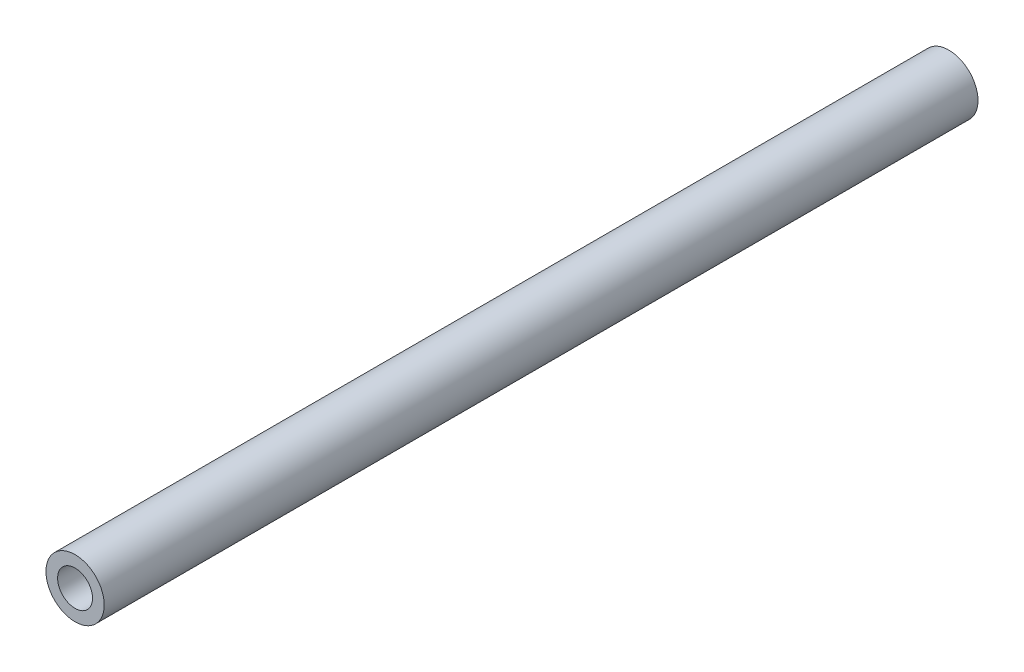
ISO-10303-21;
HEADER;
FILE_DESCRIPTION(('STEP AP214'),'2;1');
FILE_NAME('part.step','',(''),(''),'','','');
FILE_SCHEMA(('AUTOMOTIVE_DESIGN { 1 0 10303 214 1 1 1 1 }'));
ENDSEC;
DATA;
#1=APPLICATION_CONTEXT('core data for automotive mechanical design processes');
#2=APPLICATION_PROTOCOL_DEFINITION('international standard','automotive_design',2000,#1);
#3=PRODUCT_CONTEXT('',#1,'mechanical');
#4=PRODUCT('Part','Part','',(#3));
#5=PRODUCT_RELATED_PRODUCT_CATEGORY('part','',(#4));
#6=PRODUCT_DEFINITION_FORMATION('','',#4);
#7=PRODUCT_DEFINITION_CONTEXT('part definition',#1,'design');
#8=PRODUCT_DEFINITION('design','',#6,#7);
#9=PRODUCT_DEFINITION_SHAPE('','',#8);
#10=(LENGTH_UNIT() NAMED_UNIT(*) SI_UNIT(.MILLI.,.METRE.));
#11=(NAMED_UNIT(*) PLANE_ANGLE_UNIT() SI_UNIT($,.RADIAN.));
#12=(NAMED_UNIT(*) SI_UNIT($,.STERADIAN.) SOLID_ANGLE_UNIT());
#13=UNCERTAINTY_MEASURE_WITH_UNIT(LENGTH_MEASURE(1.E-05),#10,'distance_accuracy_value','');
#14=(GEOMETRIC_REPRESENTATION_CONTEXT(3) GLOBAL_UNCERTAINTY_ASSIGNED_CONTEXT((#13)) GLOBAL_UNIT_ASSIGNED_CONTEXT((#10,
#11,#12)) REPRESENTATION_CONTEXT('',''));
#15=CARTESIAN_POINT('',(0.,0.,0.));
#16=DIRECTION('',(0.,0.,1.));
#17=DIRECTION('',(1.,0.,0.));
#18=AXIS2_PLACEMENT_3D('',#15,#16,#17);
#19=CARTESIAN_POINT('',(0.,0.,37.5));
#20=DIRECTION('',(0.,0.,1.));
#21=DIRECTION('',(1.,0.,0.));
#22=AXIS2_PLACEMENT_3D('',#19,#20,#21);
#23=PLANE('',#22);
#24=CARTESIAN_POINT('',(0.,0.,37.5));
#25=DIRECTION('',(0.,0.,1.));
#26=DIRECTION('',(1.,0.,0.));
#27=AXIS2_PLACEMENT_3D('',#24,#25,#26);
#28=CIRCLE('',#27,2.5);
#29=CARTESIAN_POINT('',(2.5,0.,37.5));
#30=VERTEX_POINT('',#29);
#31=EDGE_CURVE('E10',#30,#30,#28,.T.);
#32=ORIENTED_EDGE('',*,*,#31,.T.);
#33=EDGE_LOOP('',(#32));
#34=FACE_BOUND('',#33,.T.);
#35=CARTESIAN_POINT('',(0.,0.,37.5));
#36=DIRECTION('',(0.,0.,1.));
#37=DIRECTION('',(1.,0.,0.));
#38=AXIS2_PLACEMENT_3D('',#35,#36,#37);
#39=CIRCLE('',#38,1.5);
#40=CARTESIAN_POINT('',(1.5,0.,37.5));
#41=VERTEX_POINT('',#40);
#42=EDGE_CURVE('E42',#41,#41,#39,.T.);
#43=ORIENTED_EDGE('',*,*,#42,.F.);
#44=EDGE_LOOP('',(#43));
#45=FACE_BOUND('',#44,.T.);
#46=ADVANCED_FACE('F31',(#34,#45),#23,.T.);
#47=CARTESIAN_POINT('',(0.,0.,-37.5));
#48=DIRECTION('',(0.,0.,1.));
#49=DIRECTION('',(1.,0.,0.));
#50=AXIS2_PLACEMENT_3D('',#47,#48,#49);
#51=PLANE('',#50);
#52=CARTESIAN_POINT('',(0.,0.,-37.5));
#53=DIRECTION('',(0.,0.,1.));
#54=DIRECTION('',(1.,0.,0.));
#55=AXIS2_PLACEMENT_3D('',#52,#53,#54);
#56=CIRCLE('',#55,2.5);
#57=CARTESIAN_POINT('',(2.5,0.,-37.5));
#58=VERTEX_POINT('',#57);
#59=EDGE_CURVE('E35',#58,#58,#56,.T.);
#60=ORIENTED_EDGE('',*,*,#59,.F.);
#61=EDGE_LOOP('',(#60));
#62=FACE_BOUND('',#61,.T.);
#63=CARTESIAN_POINT('',(0.,0.,-37.5));
#64=DIRECTION('',(0.,0.,1.));
#65=DIRECTION('',(1.,0.,0.));
#66=AXIS2_PLACEMENT_3D('',#63,#64,#65);
#67=CIRCLE('',#66,1.5);
#68=CARTESIAN_POINT('',(1.5,0.,-37.5));
#69=VERTEX_POINT('',#68);
#70=EDGE_CURVE('E44',#69,#69,#67,.T.);
#71=ORIENTED_EDGE('',*,*,#70,.T.);
#72=EDGE_LOOP('',(#71));
#73=FACE_BOUND('',#72,.T.);
#74=ADVANCED_FACE('F54',(#62,#73),#51,.F.);
#75=CARTESIAN_POINT('',(0.,0.,37.5));
#76=DIRECTION('',(0.,0.,-1.));
#77=DIRECTION('',(-1.,0.,0.));
#78=AXIS2_PLACEMENT_3D('',#75,#76,#77);
#79=CYLINDRICAL_SURFACE('',#78,2.5);
#80=ORIENTED_EDGE('',*,*,#31,.F.);
#81=EDGE_LOOP('',(#80));
#82=FACE_BOUND('',#81,.T.);
#83=ORIENTED_EDGE('',*,*,#59,.T.);
#84=EDGE_LOOP('',(#83));
#85=FACE_BOUND('',#84,.T.);
#86=ADVANCED_FACE('F33',(#82,#85),#79,.T.);
#87=CARTESIAN_POINT('',(0.,0.,37.5));
#88=DIRECTION('',(0.,0.,-1.));
#89=DIRECTION('',(-1.,0.,0.));
#90=AXIS2_PLACEMENT_3D('',#87,#88,#89);
#91=CYLINDRICAL_SURFACE('',#90,1.5);
#92=ORIENTED_EDGE('',*,*,#42,.T.);
#93=EDGE_LOOP('',(#92));
#94=FACE_BOUND('',#93,.T.);
#95=ORIENTED_EDGE('',*,*,#70,.F.);
#96=EDGE_LOOP('',(#95));
#97=FACE_BOUND('',#96,.T.);
#98=ADVANCED_FACE('F50',(#94,#97),#91,.F.);
#99=CLOSED_SHELL('',(#46,#74,#86,#98));
#100=MANIFOLD_SOLID_BREP('B2',#99);
#101=ADVANCED_BREP_SHAPE_REPRESENTATION('',(#18,#100),#14);
#102=SHAPE_DEFINITION_REPRESENTATION(#9,#101);
ENDSEC;
END-ISO-10303-21;
